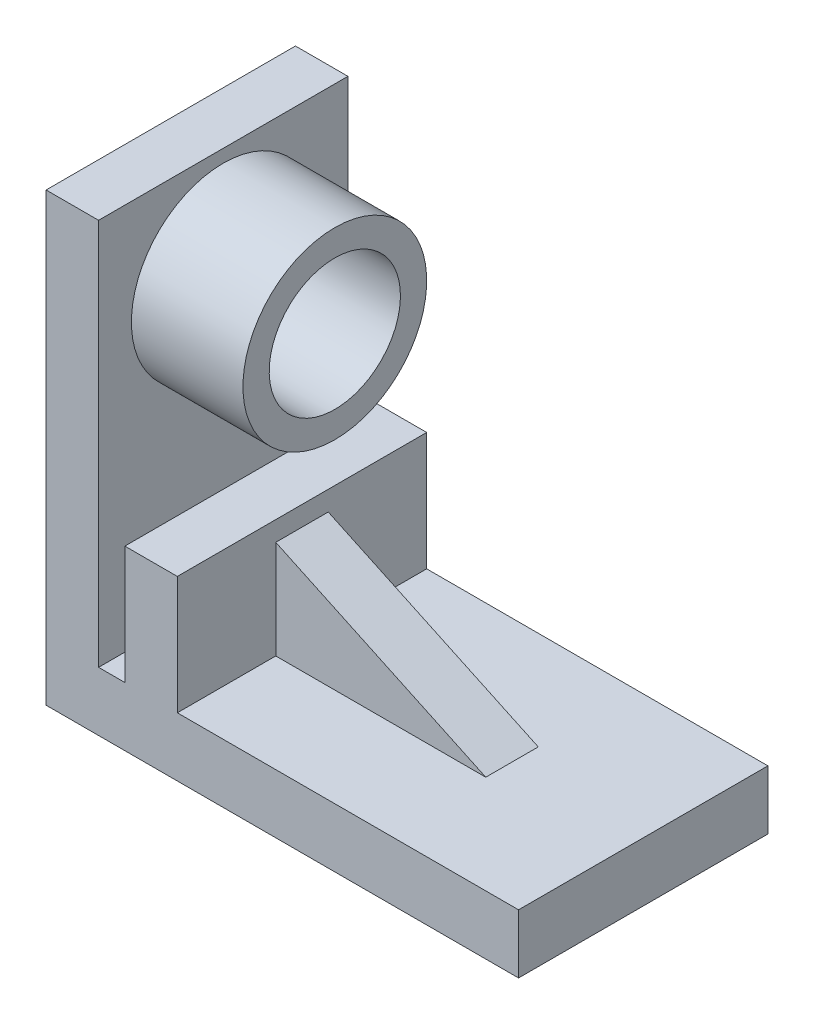
ISO-10303-21;
HEADER;
FILE_DESCRIPTION(('STEP AP214'),'2;1');
FILE_NAME('part.step','',(''),(''),'','','');
FILE_SCHEMA(('AUTOMOTIVE_DESIGN { 1 0 10303 214 1 1 1 1 }'));
ENDSEC;
DATA;
#1=APPLICATION_CONTEXT('core data for automotive mechanical design processes');
#2=APPLICATION_PROTOCOL_DEFINITION('international standard','automotive_design',2000,#1);
#3=PRODUCT_CONTEXT('',#1,'mechanical');
#4=PRODUCT('Part','Part','',(#3));
#5=PRODUCT_RELATED_PRODUCT_CATEGORY('part','',(#4));
#6=PRODUCT_DEFINITION_FORMATION('','',#4);
#7=PRODUCT_DEFINITION_CONTEXT('part definition',#1,'design');
#8=PRODUCT_DEFINITION('design','',#6,#7);
#9=PRODUCT_DEFINITION_SHAPE('','',#8);
#10=(LENGTH_UNIT() NAMED_UNIT(*) SI_UNIT(.MILLI.,.METRE.));
#11=(NAMED_UNIT(*) PLANE_ANGLE_UNIT() SI_UNIT($,.RADIAN.));
#12=(NAMED_UNIT(*) SI_UNIT($,.STERADIAN.) SOLID_ANGLE_UNIT());
#13=UNCERTAINTY_MEASURE_WITH_UNIT(LENGTH_MEASURE(1.E-05),#10,'distance_accuracy_value','');
#14=(GEOMETRIC_REPRESENTATION_CONTEXT(3) GLOBAL_UNCERTAINTY_ASSIGNED_CONTEXT((#13)) GLOBAL_UNIT_ASSIGNED_CONTEXT((#10,
#11,#12)) REPRESENTATION_CONTEXT('',''));
#15=CARTESIAN_POINT('',(0.,0.,0.));
#16=DIRECTION('',(0.,0.,1.));
#17=DIRECTION('',(1.,0.,0.));
#18=AXIS2_PLACEMENT_3D('',#15,#16,#17);
#19=CARTESIAN_POINT('',(20.,9.,19.));
#20=DIRECTION('',(0.,-1.,0.));
#21=DIRECTION('',(0.,0.,-1.));
#22=AXIS2_PLACEMENT_3D('',#19,#20,#21);
#23=PLANE('',#22);
#24=DIRECTION('',(-1.,0.,0.));
#25=VECTOR('',#24,1.);
#26=CARTESIAN_POINT('',(52.,9.00000000000001,-3.99999999999985));
#27=LINE('',#26,#25);
#28=CARTESIAN_POINT('',(52.,9.,-3.99999999999985));
#29=VERTEX_POINT('',#28);
#30=CARTESIAN_POINT('',(20.,9.,-3.99999999999985));
#31=VERTEX_POINT('',#30);
#32=EDGE_CURVE('E158',#29,#31,#27,.T.);
#33=ORIENTED_EDGE('',*,*,#32,.F.);
#34=DIRECTION('',(0.,0.,-1.));
#35=VECTOR('',#34,1.);
#36=CARTESIAN_POINT('',(52.,9.00000000000001,-3.99999999999985));
#37=LINE('',#36,#35);
#38=CARTESIAN_POINT('',(52.,9.,4.00000000000015));
#39=VERTEX_POINT('',#38);
#40=EDGE_CURVE('E152',#39,#29,#37,.T.);
#41=ORIENTED_EDGE('',*,*,#40,.F.);
#42=DIRECTION('',(-1.,0.,0.));
#43=VECTOR('',#42,1.);
#44=CARTESIAN_POINT('',(52.,9.00000000000001,4.));
#45=LINE('',#44,#43);
#46=CARTESIAN_POINT('',(20.,9.,4.));
#47=VERTEX_POINT('',#46);
#48=EDGE_CURVE('E145',#39,#47,#45,.T.);
#49=ORIENTED_EDGE('',*,*,#48,.T.);
#50=DIRECTION('',(0.,0.,-1.));
#51=VECTOR('',#50,1.);
#52=CARTESIAN_POINT('',(20.,9.,19.));
#53=LINE('',#52,#51);
#54=CARTESIAN_POINT('',(20.,9.,19.));
#55=VERTEX_POINT('',#54);
#56=EDGE_CURVE('E151',#55,#47,#53,.T.);
#57=ORIENTED_EDGE('',*,*,#56,.F.);
#58=DIRECTION('',(-1.,0.,0.));
#59=VECTOR('',#58,1.);
#60=CARTESIAN_POINT('',(20.,9.,19.));
#61=LINE('',#60,#59);
#62=CARTESIAN_POINT('',(72.,9.,19.));
#63=VERTEX_POINT('',#62);
#64=EDGE_CURVE('E168',#63,#55,#61,.T.);
#65=ORIENTED_EDGE('',*,*,#64,.F.);
#66=DIRECTION('',(0.,0.,-1.));
#67=VECTOR('',#66,1.);
#68=CARTESIAN_POINT('',(72.,9.,19.));
#69=LINE('',#68,#67);
#70=CARTESIAN_POINT('',(72.,9.,-19.));
#71=VERTEX_POINT('',#70);
#72=EDGE_CURVE('E226',#63,#71,#69,.T.);
#73=ORIENTED_EDGE('',*,*,#72,.T.);
#74=DIRECTION('',(-1.,0.,0.));
#75=VECTOR('',#74,1.);
#76=CARTESIAN_POINT('',(20.,9.,-19.));
#77=LINE('',#76,#75);
#78=CARTESIAN_POINT('',(20.,9.,-19.));
#79=VERTEX_POINT('',#78);
#80=EDGE_CURVE('E189',#71,#79,#77,.T.);
#81=ORIENTED_EDGE('',*,*,#80,.T.);
#82=EDGE_CURVE('E224',#31,#79,#53,.T.);
#83=ORIENTED_EDGE('',*,*,#82,.F.);
#84=EDGE_LOOP('',(#33,#41,#49,#57,#65,#73,#81,#83));
#85=FACE_BOUND('',#84,.T.);
#86=ADVANCED_FACE('F39',(#85),#23,.F.);
#87=CARTESIAN_POINT('',(20.,27.,19.));
#88=DIRECTION('',(-1.,0.,0.));
#89=DIRECTION('',(0.,-1.,0.));
#90=AXIS2_PLACEMENT_3D('',#87,#88,#89);
#91=PLANE('',#90);
#92=DIRECTION('',(0.,1.,0.));
#93=VECTOR('',#92,1.);
#94=CARTESIAN_POINT('',(20.,27.,-19.));
#95=LINE('',#94,#93);
#96=CARTESIAN_POINT('',(20.,27.,-19.));
#97=VERTEX_POINT('',#96);
#98=EDGE_CURVE('E191',#79,#97,#95,.T.);
#99=ORIENTED_EDGE('',*,*,#98,.T.);
#100=DIRECTION('',(0.,0.,-1.));
#101=VECTOR('',#100,1.);
#102=CARTESIAN_POINT('',(20.,27.,19.));
#103=LINE('',#102,#101);
#104=CARTESIAN_POINT('',(20.,27.,19.));
#105=VERTEX_POINT('',#104);
#106=EDGE_CURVE('E221',#105,#97,#103,.T.);
#107=ORIENTED_EDGE('',*,*,#106,.F.);
#108=DIRECTION('',(0.,1.,0.));
#109=VECTOR('',#108,1.);
#110=CARTESIAN_POINT('',(20.,27.,19.));
#111=LINE('',#110,#109);
#112=EDGE_CURVE('E170',#55,#105,#111,.T.);
#113=ORIENTED_EDGE('',*,*,#112,.F.);
#114=ORIENTED_EDGE('',*,*,#56,.T.);
#115=DIRECTION('',(0.,-1.,0.));
#116=VECTOR('',#115,1.);
#117=CARTESIAN_POINT('',(20.,9.,4.));
#118=LINE('',#117,#116);
#119=CARTESIAN_POINT('',(20.,24.,3.99999999999991));
#120=VERTEX_POINT('',#119);
#121=EDGE_CURVE('E138',#120,#47,#118,.T.);
#122=ORIENTED_EDGE('',*,*,#121,.F.);
#123=DIRECTION('',(0.,0.,1.));
#124=VECTOR('',#123,1.);
#125=CARTESIAN_POINT('',(20.,24.,4.00000000000015));
#126=LINE('',#125,#124);
#127=CARTESIAN_POINT('',(20.,24.,-3.99999999999985));
#128=VERTEX_POINT('',#127);
#129=EDGE_CURVE('E133',#128,#120,#126,.T.);
#130=ORIENTED_EDGE('',*,*,#129,.F.);
#131=DIRECTION('',(0.,1.,0.));
#132=VECTOR('',#131,1.);
#133=CARTESIAN_POINT('',(20.,24.,-3.99999999999985));
#134=LINE('',#133,#132);
#135=EDGE_CURVE('E62',#31,#128,#134,.T.);
#136=ORIENTED_EDGE('',*,*,#135,.F.);
#137=ORIENTED_EDGE('',*,*,#82,.T.);
#138=EDGE_LOOP('',(#99,#107,#113,#114,#122,#130,#136,#137));
#139=FACE_BOUND('',#138,.T.);
#140=ADVANCED_FACE('F148',(#139),#91,.F.);
#141=CARTESIAN_POINT('',(72.,0.,19.));
#142=DIRECTION('',(0.,1.,0.));
#143=DIRECTION('',(-1.,0.,0.));
#144=AXIS2_PLACEMENT_3D('',#141,#142,#143);
#145=PLANE('',#144);
#146=DIRECTION('',(1.,0.,0.));
#147=VECTOR('',#146,1.);
#148=CARTESIAN_POINT('',(72.,0.,-19.));
#149=LINE('',#148,#147);
#150=CARTESIAN_POINT('',(0.,0.,-19.));
#151=VERTEX_POINT('',#150);
#152=CARTESIAN_POINT('',(72.,0.,-19.));
#153=VERTEX_POINT('',#152);
#154=EDGE_CURVE('E161',#151,#153,#149,.T.);
#155=ORIENTED_EDGE('',*,*,#154,.T.);
#156=DIRECTION('',(0.,0.,-1.));
#157=VECTOR('',#156,1.);
#158=CARTESIAN_POINT('',(72.,0.,19.));
#159=LINE('',#158,#157);
#160=CARTESIAN_POINT('',(72.,0.,19.));
#161=VERTEX_POINT('',#160);
#162=EDGE_CURVE('E47',#161,#153,#159,.T.);
#163=ORIENTED_EDGE('',*,*,#162,.F.);
#164=DIRECTION('',(1.,0.,0.));
#165=VECTOR('',#164,1.);
#166=CARTESIAN_POINT('',(72.,0.,19.));
#167=LINE('',#166,#165);
#168=CARTESIAN_POINT('',(0.,0.,19.));
#169=VERTEX_POINT('',#168);
#170=EDGE_CURVE('E162',#169,#161,#167,.T.);
#171=ORIENTED_EDGE('',*,*,#170,.F.);
#172=DIRECTION('',(0.,0.,-1.));
#173=VECTOR('',#172,1.);
#174=CARTESIAN_POINT('',(0.,0.,19.));
#175=LINE('',#174,#173);
#176=EDGE_CURVE('E184',#169,#151,#175,.T.);
#177=ORIENTED_EDGE('',*,*,#176,.T.);
#178=EDGE_LOOP('',(#155,#163,#171,#177));
#179=FACE_BOUND('',#178,.T.);
#180=ADVANCED_FACE('F41',(#179),#145,.F.);
#181=CARTESIAN_POINT('',(72.,9.,19.));
#182=DIRECTION('',(-1.,0.,0.));
#183=DIRECTION('',(0.,0.,1.));
#184=AXIS2_PLACEMENT_3D('',#181,#182,#183);
#185=PLANE('',#184);
#186=DIRECTION('',(0.,1.,0.));
#187=VECTOR('',#186,1.);
#188=CARTESIAN_POINT('',(72.,9.,-19.));
#189=LINE('',#188,#187);
#190=EDGE_CURVE('E187',#153,#71,#189,.T.);
#191=ORIENTED_EDGE('',*,*,#190,.T.);
#192=ORIENTED_EDGE('',*,*,#72,.F.);
#193=DIRECTION('',(0.,1.,0.));
#194=VECTOR('',#193,1.);
#195=CARTESIAN_POINT('',(72.,9.,19.));
#196=LINE('',#195,#194);
#197=EDGE_CURVE('E165',#161,#63,#196,.T.);
#198=ORIENTED_EDGE('',*,*,#197,.F.);
#199=ORIENTED_EDGE('',*,*,#162,.T.);
#200=EDGE_LOOP('',(#191,#192,#198,#199));
#201=FACE_BOUND('',#200,.T.);
#202=ADVANCED_FACE('F231',(#201),#185,.F.);
#203=CARTESIAN_POINT('',(12.,27.,19.));
#204=DIRECTION('',(0.,-1.,0.));
#205=DIRECTION('',(1.,0.,0.));
#206=AXIS2_PLACEMENT_3D('',#203,#204,#205);
#207=PLANE('',#206);
#208=DIRECTION('',(-1.,0.,0.));
#209=VECTOR('',#208,1.);
#210=CARTESIAN_POINT('',(12.,27.,-19.));
#211=LINE('',#210,#209);
#212=CARTESIAN_POINT('',(12.,27.,-19.));
#213=VERTEX_POINT('',#212);
#214=EDGE_CURVE('E193',#97,#213,#211,.T.);
#215=ORIENTED_EDGE('',*,*,#214,.T.);
#216=DIRECTION('',(0.,0.,-1.));
#217=VECTOR('',#216,1.);
#218=CARTESIAN_POINT('',(12.,27.,19.));
#219=LINE('',#218,#217);
#220=CARTESIAN_POINT('',(12.,27.,19.));
#221=VERTEX_POINT('',#220);
#222=EDGE_CURVE('E218',#221,#213,#219,.T.);
#223=ORIENTED_EDGE('',*,*,#222,.F.);
#224=DIRECTION('',(-1.,0.,0.));
#225=VECTOR('',#224,1.);
#226=CARTESIAN_POINT('',(12.,27.,19.));
#227=LINE('',#226,#225);
#228=EDGE_CURVE('E172',#105,#221,#227,.T.);
#229=ORIENTED_EDGE('',*,*,#228,.F.);
#230=ORIENTED_EDGE('',*,*,#106,.T.);
#231=EDGE_LOOP('',(#215,#223,#229,#230));
#232=FACE_BOUND('',#231,.T.);
#233=ADVANCED_FACE('F250',(#232),#207,.F.);
#234=CARTESIAN_POINT('',(12.,9.00000000000001,19.));
#235=DIRECTION('',(1.,0.,0.));
#236=DIRECTION('',(0.,0.,-1.));
#237=AXIS2_PLACEMENT_3D('',#234,#235,#236);
#238=PLANE('',#237);
#239=DIRECTION('',(0.,-1.,0.));
#240=VECTOR('',#239,1.);
#241=CARTESIAN_POINT('',(12.,9.00000000000001,-19.));
#242=LINE('',#241,#240);
#243=CARTESIAN_POINT('',(12.,9.00000000000001,-19.));
#244=VERTEX_POINT('',#243);
#245=EDGE_CURVE('E195',#213,#244,#242,.T.);
#246=ORIENTED_EDGE('',*,*,#245,.T.);
#247=DIRECTION('',(0.,0.,-1.));
#248=VECTOR('',#247,1.);
#249=CARTESIAN_POINT('',(12.,9.00000000000001,19.));
#250=LINE('',#249,#248);
#251=CARTESIAN_POINT('',(12.,9.00000000000001,19.));
#252=VERTEX_POINT('',#251);
#253=EDGE_CURVE('E215',#252,#244,#250,.T.);
#254=ORIENTED_EDGE('',*,*,#253,.F.);
#255=DIRECTION('',(0.,-1.,0.));
#256=VECTOR('',#255,1.);
#257=CARTESIAN_POINT('',(12.,9.00000000000001,19.));
#258=LINE('',#257,#256);
#259=EDGE_CURVE('E174',#221,#252,#258,.T.);
#260=ORIENTED_EDGE('',*,*,#259,.F.);
#261=ORIENTED_EDGE('',*,*,#222,.T.);
#262=EDGE_LOOP('',(#246,#254,#260,#261));
#263=FACE_BOUND('',#262,.T.);
#264=ADVANCED_FACE('F257',(#263),#238,.F.);
#265=CARTESIAN_POINT('',(8.00000000000001,9.00000000000001,19.));
#266=DIRECTION('',(0.,-1.,0.));
#267=DIRECTION('',(0.,0.,-1.));
#268=AXIS2_PLACEMENT_3D('',#265,#266,#267);
#269=PLANE('',#268);
#270=DIRECTION('',(-1.,0.,0.));
#271=VECTOR('',#270,1.);
#272=CARTESIAN_POINT('',(8.00000000000001,9.00000000000001,-19.));
#273=LINE('',#272,#271);
#274=CARTESIAN_POINT('',(8.00000000000001,9.00000000000001,-19.));
#275=VERTEX_POINT('',#274);
#276=EDGE_CURVE('E197',#244,#275,#273,.T.);
#277=ORIENTED_EDGE('',*,*,#276,.T.);
#278=DIRECTION('',(0.,0.,-1.));
#279=VECTOR('',#278,1.);
#280=CARTESIAN_POINT('',(8.00000000000001,9.00000000000001,19.));
#281=LINE('',#280,#279);
#282=CARTESIAN_POINT('',(8.00000000000001,9.00000000000001,19.));
#283=VERTEX_POINT('',#282);
#284=EDGE_CURVE('E212',#283,#275,#281,.T.);
#285=ORIENTED_EDGE('',*,*,#284,.F.);
#286=DIRECTION('',(-1.,0.,0.));
#287=VECTOR('',#286,1.);
#288=CARTESIAN_POINT('',(8.00000000000001,9.00000000000001,19.));
#289=LINE('',#288,#287);
#290=EDGE_CURVE('E176',#252,#283,#289,.T.);
#291=ORIENTED_EDGE('',*,*,#290,.F.);
#292=ORIENTED_EDGE('',*,*,#253,.T.);
#293=EDGE_LOOP('',(#277,#285,#291,#292));
#294=FACE_BOUND('',#293,.T.);
#295=ADVANCED_FACE('F261',(#294),#269,.F.);
#296=CARTESIAN_POINT('',(8.,68.,19.));
#297=DIRECTION('',(-1.,0.,0.));
#298=DIRECTION('',(0.,-1.,0.));
#299=AXIS2_PLACEMENT_3D('',#296,#297,#298);
#300=PLANE('',#299);
#301=CARTESIAN_POINT('',(8.,52.035144157758,0.));
#302=DIRECTION('',(-1.,0.,0.));
#303=DIRECTION('',(0.,-1.,0.));
#304=AXIS2_PLACEMENT_3D('',#301,#302,#303);
#305=CIRCLE('',#304,14.);
#306=CARTESIAN_POINT('',(8.00000000000001,38.035144157758,0.));
#307=VERTEX_POINT('',#306);
#308=EDGE_CURVE('E11',#307,#307,#305,.F.);
#309=ORIENTED_EDGE('',*,*,#308,.F.);
#310=EDGE_LOOP('',(#309));
#311=FACE_BOUND('',#310,.T.);
#312=DIRECTION('',(0.,1.,0.));
#313=VECTOR('',#312,1.);
#314=CARTESIAN_POINT('',(8.,68.,-19.));
#315=LINE('',#314,#313);
#316=CARTESIAN_POINT('',(8.,68.,-19.));
#317=VERTEX_POINT('',#316);
#318=EDGE_CURVE('E199',#275,#317,#315,.T.);
#319=ORIENTED_EDGE('',*,*,#318,.T.);
#320=DIRECTION('',(0.,0.,-1.));
#321=VECTOR('',#320,1.);
#322=CARTESIAN_POINT('',(8.,68.,19.));
#323=LINE('',#322,#321);
#324=CARTESIAN_POINT('',(8.,68.,19.));
#325=VERTEX_POINT('',#324);
#326=EDGE_CURVE('E209',#325,#317,#323,.T.);
#327=ORIENTED_EDGE('',*,*,#326,.F.);
#328=DIRECTION('',(0.,1.,0.));
#329=VECTOR('',#328,1.);
#330=CARTESIAN_POINT('',(8.,68.,19.));
#331=LINE('',#330,#329);
#332=EDGE_CURVE('E178',#283,#325,#331,.T.);
#333=ORIENTED_EDGE('',*,*,#332,.F.);
#334=ORIENTED_EDGE('',*,*,#284,.T.);
#335=EDGE_LOOP('',(#319,#327,#333,#334));
#336=FACE_BOUND('',#335,.T.);
#337=ADVANCED_FACE('F340',(#311,#336),#300,.F.);
#338=CARTESIAN_POINT('',(0.,68.,19.));
#339=DIRECTION('',(0.,-1.,0.));
#340=DIRECTION('',(0.,0.,-1.));
#341=AXIS2_PLACEMENT_3D('',#338,#339,#340);
#342=PLANE('',#341);
#343=DIRECTION('',(-1.,0.,0.));
#344=VECTOR('',#343,1.);
#345=CARTESIAN_POINT('',(0.,68.,-19.));
#346=LINE('',#345,#344);
#347=CARTESIAN_POINT('',(0.,68.,-19.));
#348=VERTEX_POINT('',#347);
#349=EDGE_CURVE('E201',#317,#348,#346,.T.);
#350=ORIENTED_EDGE('',*,*,#349,.T.);
#351=DIRECTION('',(0.,0.,-1.));
#352=VECTOR('',#351,1.);
#353=CARTESIAN_POINT('',(0.,68.,19.));
#354=LINE('',#353,#352);
#355=CARTESIAN_POINT('',(0.,68.,19.));
#356=VERTEX_POINT('',#355);
#357=EDGE_CURVE('E206',#356,#348,#354,.T.);
#358=ORIENTED_EDGE('',*,*,#357,.F.);
#359=DIRECTION('',(-1.,0.,0.));
#360=VECTOR('',#359,1.);
#361=CARTESIAN_POINT('',(0.,68.,19.));
#362=LINE('',#361,#360);
#363=EDGE_CURVE('E180',#325,#356,#362,.T.);
#364=ORIENTED_EDGE('',*,*,#363,.F.);
#365=ORIENTED_EDGE('',*,*,#326,.T.);
#366=EDGE_LOOP('',(#350,#358,#364,#365));
#367=FACE_BOUND('',#366,.T.);
#368=ADVANCED_FACE('F349',(#367),#342,.F.);
#369=CARTESIAN_POINT('',(0.,0.,19.));
#370=DIRECTION('',(1.,0.,0.));
#371=DIRECTION('',(0.,0.,-1.));
#372=AXIS2_PLACEMENT_3D('',#369,#370,#371);
#373=PLANE('',#372);
#374=DIRECTION('',(0.,-1.,0.));
#375=VECTOR('',#374,1.);
#376=CARTESIAN_POINT('',(0.,0.,-19.));
#377=LINE('',#376,#375);
#378=EDGE_CURVE('E166',#348,#151,#377,.T.);
#379=ORIENTED_EDGE('',*,*,#378,.T.);
#380=ORIENTED_EDGE('',*,*,#176,.F.);
#381=DIRECTION('',(0.,-1.,0.));
#382=VECTOR('',#381,1.);
#383=CARTESIAN_POINT('',(0.,0.,19.));
#384=LINE('',#383,#382);
#385=EDGE_CURVE('E182',#356,#169,#384,.T.);
#386=ORIENTED_EDGE('',*,*,#385,.F.);
#387=ORIENTED_EDGE('',*,*,#357,.T.);
#388=EDGE_LOOP('',(#379,#380,#386,#387));
#389=FACE_BOUND('',#388,.T.);
#390=ADVANCED_FACE('F359',(#389),#373,.F.);
#391=CARTESIAN_POINT('',(0.,0.,19.));
#392=DIRECTION('',(0.,0.,-1.));
#393=DIRECTION('',(-1.,0.,0.));
#394=AXIS2_PLACEMENT_3D('',#391,#392,#393);
#395=PLANE('',#394);
#396=ORIENTED_EDGE('',*,*,#170,.T.);
#397=ORIENTED_EDGE('',*,*,#197,.T.);
#398=ORIENTED_EDGE('',*,*,#64,.T.);
#399=ORIENTED_EDGE('',*,*,#112,.T.);
#400=ORIENTED_EDGE('',*,*,#228,.T.);
#401=ORIENTED_EDGE('',*,*,#259,.T.);
#402=ORIENTED_EDGE('',*,*,#290,.T.);
#403=ORIENTED_EDGE('',*,*,#332,.T.);
#404=ORIENTED_EDGE('',*,*,#363,.T.);
#405=ORIENTED_EDGE('',*,*,#385,.T.);
#406=EDGE_LOOP('',(#396,#397,#398,#399,#400,#401,#402,#403,#404,#405));
#407=FACE_BOUND('',#406,.T.);
#408=ADVANCED_FACE('F265',(#407),#395,.F.);
#409=CARTESIAN_POINT('',(0.,0.,-19.));
#410=DIRECTION('',(0.,0.,-1.));
#411=DIRECTION('',(-1.,0.,0.));
#412=AXIS2_PLACEMENT_3D('',#409,#410,#411);
#413=PLANE('',#412);
#414=ORIENTED_EDGE('',*,*,#154,.F.);
#415=ORIENTED_EDGE('',*,*,#378,.F.);
#416=ORIENTED_EDGE('',*,*,#349,.F.);
#417=ORIENTED_EDGE('',*,*,#318,.F.);
#418=ORIENTED_EDGE('',*,*,#276,.F.);
#419=ORIENTED_EDGE('',*,*,#245,.F.);
#420=ORIENTED_EDGE('',*,*,#214,.F.);
#421=ORIENTED_EDGE('',*,*,#98,.F.);
#422=ORIENTED_EDGE('',*,*,#80,.F.);
#423=ORIENTED_EDGE('',*,*,#190,.F.);
#424=EDGE_LOOP('',(#414,#415,#416,#417,#418,#419,#420,#421,#422,#423));
#425=FACE_BOUND('',#424,.T.);
#426=ADVANCED_FACE('F239',(#425),#413,.T.);
#427=CARTESIAN_POINT('',(52.,24.,-3.99999999999985));
#428=DIRECTION('',(0.,0.,1.));
#429=DIRECTION('',(0.,-1.,0.));
#430=AXIS2_PLACEMENT_3D('',#427,#428,#429);
#431=PLANE('',#430);
#432=ORIENTED_EDGE('',*,*,#135,.T.);
#433=DIRECTION('',(0.905458935958869,-0.42443387623072,0.));
#434=VECTOR('',#433,1.);
#435=CARTESIAN_POINT('',(46.2353883106485,11.7021617293835,-3.99999999999985));
#436=LINE('',#435,#434);
#437=EDGE_CURVE('E136',#128,#29,#436,.T.);
#438=ORIENTED_EDGE('',*,*,#437,.T.);
#439=ORIENTED_EDGE('',*,*,#32,.T.);
#440=EDGE_LOOP('',(#432,#438,#439));
#441=FACE_BOUND('',#440,.T.);
#442=ADVANCED_FACE('F268',(#441),#431,.F.);
#443=CARTESIAN_POINT('',(52.,9.00000000000001,4.));
#444=DIRECTION('',(0.,0.,-1.));
#445=DIRECTION('',(0.,1.,0.));
#446=AXIS2_PLACEMENT_3D('',#443,#444,#445);
#447=PLANE('',#446);
#448=ORIENTED_EDGE('',*,*,#48,.F.);
#449=DIRECTION('',(0.905458935958868,-0.42443387623072,0.));
#450=VECTOR('',#449,1.);
#451=CARTESIAN_POINT('',(20.,24.,3.99999999999991));
#452=LINE('',#451,#450);
#453=EDGE_CURVE('E54',#120,#39,#452,.T.);
#454=ORIENTED_EDGE('',*,*,#453,.F.);
#455=ORIENTED_EDGE('',*,*,#121,.T.);
#456=EDGE_LOOP('',(#448,#454,#455));
#457=FACE_BOUND('',#456,.T.);
#458=ADVANCED_FACE('F143',(#457),#447,.F.);
#459=CARTESIAN_POINT('',(20.,24.,-19.));
#460=DIRECTION('',(-0.42443387623072,-0.905458935958868,0.));
#461=DIRECTION('',(0.905458935958869,-0.42443387623072,0.));
#462=AXIS2_PLACEMENT_3D('',#459,#460,#461);
#463=PLANE('',#462);
#464=ORIENTED_EDGE('',*,*,#129,.T.);
#465=ORIENTED_EDGE('',*,*,#453,.T.);
#466=ORIENTED_EDGE('',*,*,#40,.T.);
#467=ORIENTED_EDGE('',*,*,#437,.F.);
#468=EDGE_LOOP('',(#464,#465,#466,#467));
#469=FACE_BOUND('',#468,.T.);
#470=ADVANCED_FACE('F134',(#469),#463,.F.);
#471=CARTESIAN_POINT('',(25.,52.035144157758,0.));
#472=DIRECTION('',(1.,0.,0.));
#473=DIRECTION('',(0.,1.,0.));
#474=AXIS2_PLACEMENT_3D('',#471,#472,#473);
#475=PLANE('',#474);
#476=CARTESIAN_POINT('',(25.,52.035144157758,0.));
#477=DIRECTION('',(1.,0.,0.));
#478=DIRECTION('',(0.,1.,0.));
#479=AXIS2_PLACEMENT_3D('',#476,#477,#478);
#480=CIRCLE('',#479,14.);
#481=CARTESIAN_POINT('',(25.,66.035144157758,0.));
#482=VERTEX_POINT('',#481);
#483=EDGE_CURVE('E146',#482,#482,#480,.T.);
#484=ORIENTED_EDGE('',*,*,#483,.T.);
#485=EDGE_LOOP('',(#484));
#486=FACE_BOUND('',#485,.T.);
#487=CARTESIAN_POINT('',(25.,52.035144157758,0.));
#488=DIRECTION('',(1.,0.,0.));
#489=DIRECTION('',(0.,1.,0.));
#490=AXIS2_PLACEMENT_3D('',#487,#488,#489);
#491=CIRCLE('',#490,10.);
#492=CARTESIAN_POINT('',(25.,62.035144157758,0.));
#493=VERTEX_POINT('',#492);
#494=EDGE_CURVE('E273',#493,#493,#491,.T.);
#495=ORIENTED_EDGE('',*,*,#494,.F.);
#496=EDGE_LOOP('',(#495));
#497=FACE_BOUND('',#496,.T.);
#498=ADVANCED_FACE('F283',(#486,#497),#475,.T.);
#499=CARTESIAN_POINT('',(25.,52.035144157758,0.));
#500=DIRECTION('',(-1.,0.,0.));
#501=DIRECTION('',(0.,-1.,0.));
#502=AXIS2_PLACEMENT_3D('',#499,#500,#501);
#503=CYLINDRICAL_SURFACE('',#502,14.);
#504=ORIENTED_EDGE('',*,*,#483,.F.);
#505=EDGE_LOOP('',(#504));
#506=FACE_BOUND('',#505,.T.);
#507=ORIENTED_EDGE('',*,*,#308,.T.);
#508=EDGE_LOOP('',(#507));
#509=FACE_BOUND('',#508,.T.);
#510=ADVANCED_FACE('F285',(#506,#509),#503,.T.);
#511=CARTESIAN_POINT('',(25.,52.035144157758,0.));
#512=DIRECTION('',(-1.,0.,0.));
#513=DIRECTION('',(0.,-1.,0.));
#514=AXIS2_PLACEMENT_3D('',#511,#512,#513);
#515=CYLINDRICAL_SURFACE('',#514,10.);
#516=ORIENTED_EDGE('',*,*,#494,.T.);
#517=EDGE_LOOP('',(#516));
#518=FACE_BOUND('',#517,.T.);
#519=CARTESIAN_POINT('',(8.,52.035144157758,0.));
#520=DIRECTION('',(1.,0.,0.));
#521=DIRECTION('',(0.,1.,0.));
#522=AXIS2_PLACEMENT_3D('',#519,#520,#521);
#523=CIRCLE('',#522,10.);
#524=CARTESIAN_POINT('',(8.,62.035144157758,0.));
#525=VERTEX_POINT('',#524);
#526=EDGE_CURVE('E274',#525,#525,#523,.T.);
#527=ORIENTED_EDGE('',*,*,#526,.F.);
#528=EDGE_LOOP('',(#527));
#529=FACE_BOUND('',#528,.T.);
#530=ADVANCED_FACE('F280',(#518,#529),#515,.F.);
#531=ORIENTED_EDGE('',*,*,#526,.T.);
#532=EDGE_LOOP('',(#531));
#533=FACE_BOUND('',#532,.T.);
#534=ADVANCED_FACE('F352',(#533),#300,.F.);
#535=CLOSED_SHELL('',(#86,#140,#180,#202,#233,#264,#295,#337,#368,#390,#408,#426,#442,#458,#470,
#498,#510,#530,#534));
#536=MANIFOLD_SOLID_BREP('B2',#535);
#537=ADVANCED_BREP_SHAPE_REPRESENTATION('',(#18,#536),#14);
#538=SHAPE_DEFINITION_REPRESENTATION(#9,#537);
ENDSEC;
END-ISO-10303-21;
